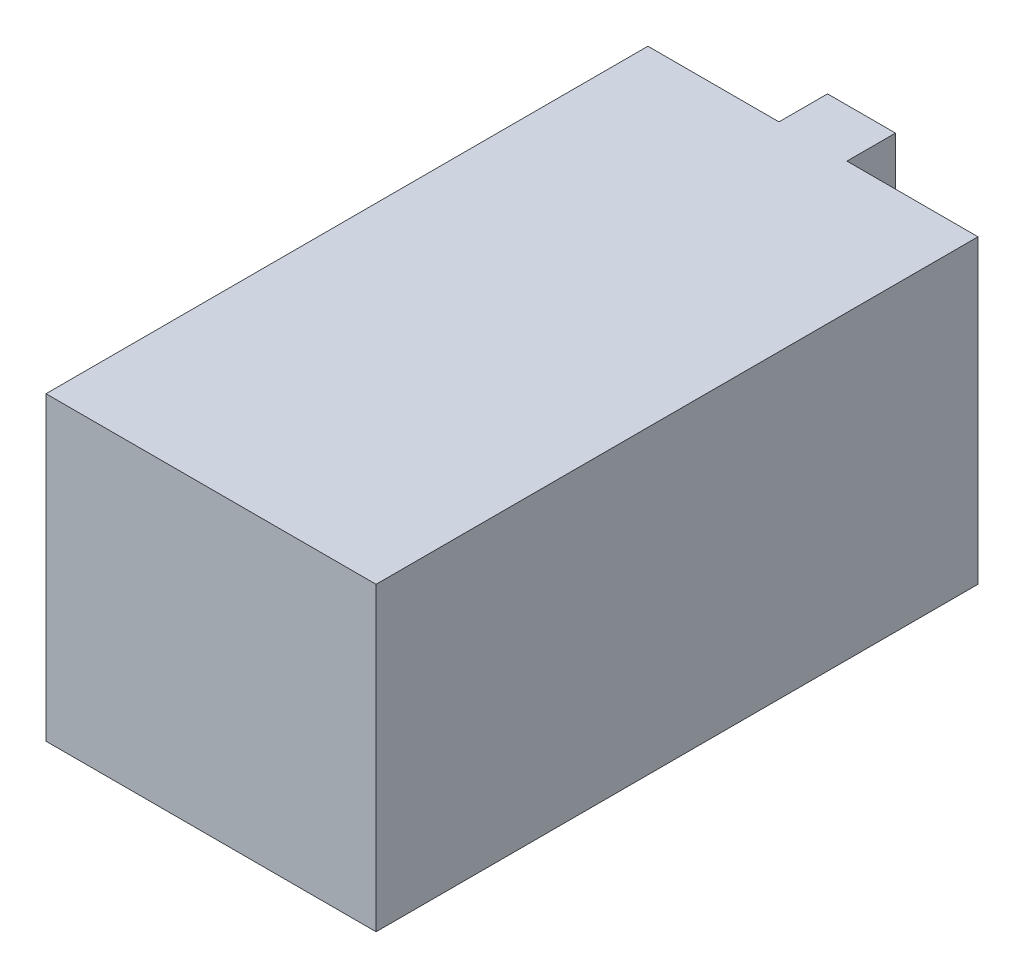
ISO-10303-21;
HEADER;
FILE_DESCRIPTION(('STEP AP214'),'2;1');
FILE_NAME('part.step','',(''),(''),'','','');
FILE_SCHEMA(('AUTOMOTIVE_DESIGN { 1 0 10303 214 1 1 1 1 }'));
ENDSEC;
DATA;
#1=APPLICATION_CONTEXT('core data for automotive mechanical design processes');
#2=APPLICATION_PROTOCOL_DEFINITION('international standard','automotive_design',2000,#1);
#3=PRODUCT_CONTEXT('',#1,'mechanical');
#4=PRODUCT('Part','Part','',(#3));
#5=PRODUCT_RELATED_PRODUCT_CATEGORY('part','',(#4));
#6=PRODUCT_DEFINITION_FORMATION('','',#4);
#7=PRODUCT_DEFINITION_CONTEXT('part definition',#1,'design');
#8=PRODUCT_DEFINITION('design','',#6,#7);
#9=PRODUCT_DEFINITION_SHAPE('','',#8);
#10=(LENGTH_UNIT() NAMED_UNIT(*) SI_UNIT(.MILLI.,.METRE.));
#11=(NAMED_UNIT(*) PLANE_ANGLE_UNIT() SI_UNIT($,.RADIAN.));
#12=(NAMED_UNIT(*) SI_UNIT($,.STERADIAN.) SOLID_ANGLE_UNIT());
#13=UNCERTAINTY_MEASURE_WITH_UNIT(LENGTH_MEASURE(1.E-05),#10,'distance_accuracy_value','');
#14=(GEOMETRIC_REPRESENTATION_CONTEXT(3) GLOBAL_UNCERTAINTY_ASSIGNED_CONTEXT((#13)) GLOBAL_UNIT_ASSIGNED_CONTEXT((#10,
#11,#12)) REPRESENTATION_CONTEXT('',''));
#15=CARTESIAN_POINT('',(0.,0.,0.));
#16=DIRECTION('',(0.,0.,1.));
#17=DIRECTION('',(1.,0.,0.));
#18=AXIS2_PLACEMENT_3D('',#15,#16,#17);
#19=CARTESIAN_POINT('',(0.,31.,-31.));
#20=DIRECTION('',(0.,0.,-1.));
#21=DIRECTION('',(-1.,0.,0.));
#22=AXIS2_PLACEMENT_3D('',#19,#20,#21);
#23=PLANE('',#22);
#24=DIRECTION('',(1.,0.,0.));
#25=VECTOR('',#24,1.);
#26=CARTESIAN_POINT('',(0.,0.,-31.));
#27=LINE('',#26,#25);
#28=CARTESIAN_POINT('',(3.5,0.,-31.));
#29=VERTEX_POINT('',#28);
#30=CARTESIAN_POINT('',(17.,0.,-31.));
#31=VERTEX_POINT('',#30);
#32=EDGE_CURVE('E130',#29,#31,#27,.T.);
#33=ORIENTED_EDGE('',*,*,#32,.F.);
#34=DIRECTION('',(0.,-1.,0.));
#35=VECTOR('',#34,1.);
#36=CARTESIAN_POINT('',(3.5,31.,-31.));
#37=LINE('',#36,#35);
#38=CARTESIAN_POINT('',(3.5,31.,-31.));
#39=VERTEX_POINT('',#38);
#40=EDGE_CURVE('E11',#39,#29,#37,.T.);
#41=ORIENTED_EDGE('',*,*,#40,.F.);
#42=DIRECTION('',(1.,0.,0.));
#43=VECTOR('',#42,1.);
#44=CARTESIAN_POINT('',(0.,31.,-31.));
#45=LINE('',#44,#43);
#46=CARTESIAN_POINT('',(17.,31.,-31.));
#47=VERTEX_POINT('',#46);
#48=EDGE_CURVE('E148',#39,#47,#45,.T.);
#49=ORIENTED_EDGE('',*,*,#48,.T.);
#50=DIRECTION('',(0.,-1.,0.));
#51=VECTOR('',#50,1.);
#52=CARTESIAN_POINT('',(17.,31.,-31.));
#53=LINE('',#52,#51);
#54=EDGE_CURVE('E52',#47,#31,#53,.T.);
#55=ORIENTED_EDGE('',*,*,#54,.T.);
#56=EDGE_LOOP('',(#33,#41,#49,#55));
#57=FACE_BOUND('',#56,.T.);
#58=ADVANCED_FACE('F35',(#57),#23,.T.);
#59=CARTESIAN_POINT('',(3.5,31.,0.));
#60=DIRECTION('',(-1.,0.,0.));
#61=DIRECTION('',(0.,0.,1.));
#62=AXIS2_PLACEMENT_3D('',#59,#60,#61);
#63=PLANE('',#62);
#64=DIRECTION('',(0.,0.,-1.));
#65=VECTOR('',#64,1.);
#66=CARTESIAN_POINT('',(3.5,0.,0.));
#67=LINE('',#66,#65);
#68=CARTESIAN_POINT('',(3.5,0.,-36.));
#69=VERTEX_POINT('',#68);
#70=EDGE_CURVE('E132',#29,#69,#67,.T.);
#71=ORIENTED_EDGE('',*,*,#70,.T.);
#72=DIRECTION('',(0.,-1.,0.));
#73=VECTOR('',#72,1.);
#74=CARTESIAN_POINT('',(3.5,31.,-36.));
#75=LINE('',#74,#73);
#76=CARTESIAN_POINT('',(3.5,31.,-36.));
#77=VERTEX_POINT('',#76);
#78=EDGE_CURVE('E44',#77,#69,#75,.T.);
#79=ORIENTED_EDGE('',*,*,#78,.F.);
#80=DIRECTION('',(0.,0.,-1.));
#81=VECTOR('',#80,1.);
#82=CARTESIAN_POINT('',(3.5,31.,0.));
#83=LINE('',#82,#81);
#84=EDGE_CURVE('E173',#39,#77,#83,.T.);
#85=ORIENTED_EDGE('',*,*,#84,.F.);
#86=ORIENTED_EDGE('',*,*,#40,.T.);
#87=EDGE_LOOP('',(#71,#79,#85,#86));
#88=FACE_BOUND('',#87,.T.);
#89=ADVANCED_FACE('F37',(#88),#63,.F.);
#90=CARTESIAN_POINT('',(0.,31.,-36.));
#91=DIRECTION('',(0.,0.,-1.));
#92=DIRECTION('',(-1.,0.,0.));
#93=AXIS2_PLACEMENT_3D('',#90,#91,#92);
#94=PLANE('',#93);
#95=DIRECTION('',(1.,0.,0.));
#96=VECTOR('',#95,1.);
#97=CARTESIAN_POINT('',(0.,0.,-36.));
#98=LINE('',#97,#96);
#99=CARTESIAN_POINT('',(-3.5,0.,-36.));
#100=VERTEX_POINT('',#99);
#101=EDGE_CURVE('E136',#100,#69,#98,.T.);
#102=ORIENTED_EDGE('',*,*,#101,.F.);
#103=DIRECTION('',(0.,-1.,0.));
#104=VECTOR('',#103,1.);
#105=CARTESIAN_POINT('',(-3.5,31.,-36.));
#106=LINE('',#105,#104);
#107=CARTESIAN_POINT('',(-3.5,31.,-36.));
#108=VERTEX_POINT('',#107);
#109=EDGE_CURVE('E154',#108,#100,#106,.T.);
#110=ORIENTED_EDGE('',*,*,#109,.F.);
#111=DIRECTION('',(1.,0.,0.));
#112=VECTOR('',#111,1.);
#113=CARTESIAN_POINT('',(0.,31.,-36.));
#114=LINE('',#113,#112);
#115=EDGE_CURVE('E161',#108,#77,#114,.T.);
#116=ORIENTED_EDGE('',*,*,#115,.T.);
#117=ORIENTED_EDGE('',*,*,#78,.T.);
#118=EDGE_LOOP('',(#102,#110,#116,#117));
#119=FACE_BOUND('',#118,.T.);
#120=ADVANCED_FACE('F159',(#119),#94,.T.);
#121=CARTESIAN_POINT('',(-3.5,31.,0.));
#122=DIRECTION('',(-1.,0.,0.));
#123=DIRECTION('',(0.,0.,1.));
#124=AXIS2_PLACEMENT_3D('',#121,#122,#123);
#125=PLANE('',#124);
#126=DIRECTION('',(0.,0.,-1.));
#127=VECTOR('',#126,1.);
#128=CARTESIAN_POINT('',(-3.5,0.,0.));
#129=LINE('',#128,#127);
#130=CARTESIAN_POINT('',(-3.5,0.,-31.));
#131=VERTEX_POINT('',#130);
#132=EDGE_CURVE('E139',#131,#100,#129,.T.);
#133=ORIENTED_EDGE('',*,*,#132,.F.);
#134=DIRECTION('',(0.,-1.,0.));
#135=VECTOR('',#134,1.);
#136=CARTESIAN_POINT('',(-3.5,31.,-31.));
#137=LINE('',#136,#135);
#138=CARTESIAN_POINT('',(-3.5,31.,-31.));
#139=VERTEX_POINT('',#138);
#140=EDGE_CURVE('E152',#139,#131,#137,.T.);
#141=ORIENTED_EDGE('',*,*,#140,.F.);
#142=DIRECTION('',(0.,0.,-1.));
#143=VECTOR('',#142,1.);
#144=CARTESIAN_POINT('',(-3.5,31.,0.));
#145=LINE('',#144,#143);
#146=EDGE_CURVE('E172',#139,#108,#145,.T.);
#147=ORIENTED_EDGE('',*,*,#146,.T.);
#148=ORIENTED_EDGE('',*,*,#109,.T.);
#149=EDGE_LOOP('',(#133,#141,#147,#148));
#150=FACE_BOUND('',#149,.T.);
#151=ADVANCED_FACE('F170',(#150),#125,.T.);
#152=CARTESIAN_POINT('',(-17.,0.,-31.));
#153=VERTEX_POINT('',#152);
#154=EDGE_CURVE('E133',#153,#131,#27,.T.);
#155=ORIENTED_EDGE('',*,*,#154,.F.);
#156=DIRECTION('',(0.,-1.,0.));
#157=VECTOR('',#156,1.);
#158=CARTESIAN_POINT('',(-17.,31.,-31.));
#159=LINE('',#158,#157);
#160=CARTESIAN_POINT('',(-17.,31.,-31.));
#161=VERTEX_POINT('',#160);
#162=EDGE_CURVE('E122',#161,#153,#159,.T.);
#163=ORIENTED_EDGE('',*,*,#162,.F.);
#164=EDGE_CURVE('E112',#161,#139,#45,.T.);
#165=ORIENTED_EDGE('',*,*,#164,.T.);
#166=ORIENTED_EDGE('',*,*,#140,.T.);
#167=EDGE_LOOP('',(#155,#163,#165,#166));
#168=FACE_BOUND('',#167,.T.);
#169=ADVANCED_FACE('F178',(#168),#23,.T.);
#170=CARTESIAN_POINT('',(-17.,31.,0.));
#171=DIRECTION('',(1.,0.,0.));
#172=DIRECTION('',(0.,0.,-1.));
#173=AXIS2_PLACEMENT_3D('',#170,#171,#172);
#174=PLANE('',#173);
#175=DIRECTION('',(0.,0.,1.));
#176=VECTOR('',#175,1.);
#177=CARTESIAN_POINT('',(-17.,0.,0.));
#178=LINE('',#177,#176);
#179=CARTESIAN_POINT('',(-17.,0.,31.));
#180=VERTEX_POINT('',#179);
#181=EDGE_CURVE('E119',#153,#180,#178,.T.);
#182=ORIENTED_EDGE('',*,*,#181,.T.);
#183=DIRECTION('',(0.,-1.,0.));
#184=VECTOR('',#183,1.);
#185=CARTESIAN_POINT('',(-17.,31.,31.));
#186=LINE('',#185,#184);
#187=CARTESIAN_POINT('',(-17.,31.,31.));
#188=VERTEX_POINT('',#187);
#189=EDGE_CURVE('E116',#188,#180,#186,.T.);
#190=ORIENTED_EDGE('',*,*,#189,.F.);
#191=DIRECTION('',(0.,0.,1.));
#192=VECTOR('',#191,1.);
#193=CARTESIAN_POINT('',(-17.,31.,0.));
#194=LINE('',#193,#192);
#195=EDGE_CURVE('E103',#161,#188,#194,.T.);
#196=ORIENTED_EDGE('',*,*,#195,.F.);
#197=ORIENTED_EDGE('',*,*,#162,.T.);
#198=EDGE_LOOP('',(#182,#190,#196,#197));
#199=FACE_BOUND('',#198,.T.);
#200=ADVANCED_FACE('F117',(#199),#174,.F.);
#201=CARTESIAN_POINT('',(0.,31.,31.));
#202=DIRECTION('',(0.,0.,-1.));
#203=DIRECTION('',(-1.,0.,0.));
#204=AXIS2_PLACEMENT_3D('',#201,#202,#203);
#205=PLANE('',#204);
#206=DIRECTION('',(1.,0.,0.));
#207=VECTOR('',#206,1.);
#208=CARTESIAN_POINT('',(0.,0.,31.));
#209=LINE('',#208,#207);
#210=CARTESIAN_POINT('',(17.,0.,31.));
#211=VERTEX_POINT('',#210);
#212=EDGE_CURVE('E143',#180,#211,#209,.T.);
#213=ORIENTED_EDGE('',*,*,#212,.T.);
#214=DIRECTION('',(0.,-1.,0.));
#215=VECTOR('',#214,1.);
#216=CARTESIAN_POINT('',(17.,31.,31.));
#217=LINE('',#216,#215);
#218=CARTESIAN_POINT('',(17.,31.,31.));
#219=VERTEX_POINT('',#218);
#220=EDGE_CURVE('E78',#219,#211,#217,.T.);
#221=ORIENTED_EDGE('',*,*,#220,.F.);
#222=DIRECTION('',(1.,0.,0.));
#223=VECTOR('',#222,1.);
#224=CARTESIAN_POINT('',(0.,31.,31.));
#225=LINE('',#224,#223);
#226=EDGE_CURVE('E109',#188,#219,#225,.T.);
#227=ORIENTED_EDGE('',*,*,#226,.F.);
#228=ORIENTED_EDGE('',*,*,#189,.T.);
#229=EDGE_LOOP('',(#213,#221,#227,#228));
#230=FACE_BOUND('',#229,.T.);
#231=ADVANCED_FACE('F124',(#230),#205,.F.);
#232=CARTESIAN_POINT('',(17.,31.,0.));
#233=DIRECTION('',(1.,0.,0.));
#234=DIRECTION('',(0.,0.,-1.));
#235=AXIS2_PLACEMENT_3D('',#232,#233,#234);
#236=PLANE('',#235);
#237=DIRECTION('',(0.,0.,1.));
#238=VECTOR('',#237,1.);
#239=CARTESIAN_POINT('',(17.,0.,0.));
#240=LINE('',#239,#238);
#241=EDGE_CURVE('E145',#31,#211,#240,.T.);
#242=ORIENTED_EDGE('',*,*,#241,.F.);
#243=ORIENTED_EDGE('',*,*,#54,.F.);
#244=DIRECTION('',(0.,0.,1.));
#245=VECTOR('',#244,1.);
#246=CARTESIAN_POINT('',(17.,31.,0.));
#247=LINE('',#246,#245);
#248=EDGE_CURVE('E125',#47,#219,#247,.T.);
#249=ORIENTED_EDGE('',*,*,#248,.T.);
#250=ORIENTED_EDGE('',*,*,#220,.T.);
#251=EDGE_LOOP('',(#242,#243,#249,#250));
#252=FACE_BOUND('',#251,.T.);
#253=ADVANCED_FACE('F179',(#252),#236,.T.);
#254=CARTESIAN_POINT('',(0.,31.,0.));
#255=DIRECTION('',(0.,1.,0.));
#256=DIRECTION('',(0.,0.,1.));
#257=AXIS2_PLACEMENT_3D('',#254,#255,#256);
#258=PLANE('',#257);
#259=ORIENTED_EDGE('',*,*,#48,.F.);
#260=ORIENTED_EDGE('',*,*,#84,.T.);
#261=ORIENTED_EDGE('',*,*,#115,.F.);
#262=ORIENTED_EDGE('',*,*,#146,.F.);
#263=ORIENTED_EDGE('',*,*,#164,.F.);
#264=ORIENTED_EDGE('',*,*,#195,.T.);
#265=ORIENTED_EDGE('',*,*,#226,.T.);
#266=ORIENTED_EDGE('',*,*,#248,.F.);
#267=EDGE_LOOP('',(#259,#260,#261,#262,#263,#264,#265,#266));
#268=FACE_BOUND('',#267,.T.);
#269=ADVANCED_FACE('F106',(#268),#258,.T.);
#270=CARTESIAN_POINT('',(0.,0.,0.));
#271=DIRECTION('',(0.,1.,0.));
#272=DIRECTION('',(0.,0.,1.));
#273=AXIS2_PLACEMENT_3D('',#270,#271,#272);
#274=PLANE('',#273);
#275=ORIENTED_EDGE('',*,*,#32,.T.);
#276=ORIENTED_EDGE('',*,*,#241,.T.);
#277=ORIENTED_EDGE('',*,*,#212,.F.);
#278=ORIENTED_EDGE('',*,*,#181,.F.);
#279=ORIENTED_EDGE('',*,*,#154,.T.);
#280=ORIENTED_EDGE('',*,*,#132,.T.);
#281=ORIENTED_EDGE('',*,*,#101,.T.);
#282=ORIENTED_EDGE('',*,*,#70,.F.);
#283=EDGE_LOOP('',(#275,#276,#277,#278,#279,#280,#281,#282));
#284=FACE_BOUND('',#283,.T.);
#285=ADVANCED_FACE('F165',(#284),#274,.F.);
#286=CLOSED_SHELL('',(#58,#89,#120,#151,#169,#200,#231,#253,#269,#285));
#287=MANIFOLD_SOLID_BREP('B2',#286);
#288=ADVANCED_BREP_SHAPE_REPRESENTATION('',(#18,#287),#14);
#289=SHAPE_DEFINITION_REPRESENTATION(#9,#288);
ENDSEC;
END-ISO-10303-21;
